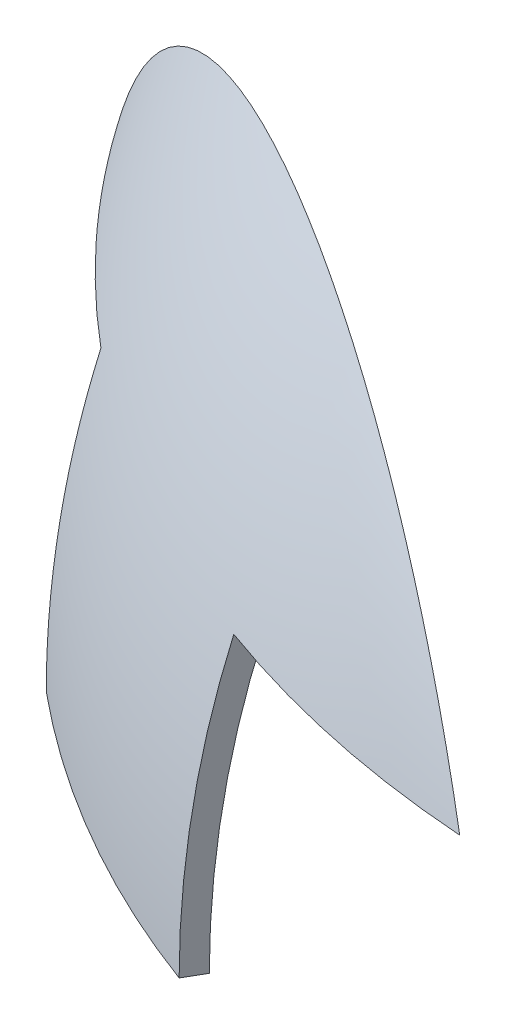
ISO-10303-21;
HEADER;
FILE_DESCRIPTION(('STEP AP214'),'2;1');
FILE_NAME('part.step','',(''),(''),'','','');
FILE_SCHEMA(('AUTOMOTIVE_DESIGN { 1 0 10303 214 1 1 1 1 }'));
ENDSEC;
DATA;
#1=APPLICATION_CONTEXT('core data for automotive mechanical design processes');
#2=APPLICATION_PROTOCOL_DEFINITION('international standard','automotive_design',2000,#1);
#3=PRODUCT_CONTEXT('',#1,'mechanical');
#4=PRODUCT('Part','Part','',(#3));
#5=PRODUCT_RELATED_PRODUCT_CATEGORY('part','',(#4));
#6=PRODUCT_DEFINITION_FORMATION('','',#4);
#7=PRODUCT_DEFINITION_CONTEXT('part definition',#1,'design');
#8=PRODUCT_DEFINITION('design','',#6,#7);
#9=PRODUCT_DEFINITION_SHAPE('','',#8);
#10=(LENGTH_UNIT() NAMED_UNIT(*) SI_UNIT(.MILLI.,.METRE.));
#11=(NAMED_UNIT(*) PLANE_ANGLE_UNIT() SI_UNIT($,.RADIAN.));
#12=(NAMED_UNIT(*) SI_UNIT($,.STERADIAN.) SOLID_ANGLE_UNIT());
#13=UNCERTAINTY_MEASURE_WITH_UNIT(LENGTH_MEASURE(1.E-05),#10,'distance_accuracy_value','');
#14=(GEOMETRIC_REPRESENTATION_CONTEXT(3) GLOBAL_UNCERTAINTY_ASSIGNED_CONTEXT((#13)) GLOBAL_UNIT_ASSIGNED_CONTEXT((#10,
#11,#12)) REPRESENTATION_CONTEXT('',''));
#15=CARTESIAN_POINT('',(0.,0.,0.));
#16=DIRECTION('',(0.,0.,1.));
#17=DIRECTION('',(1.,0.,0.));
#18=AXIS2_PLACEMENT_3D('',#15,#16,#17);
#19=CARTESIAN_POINT('',(0.,0.,0.));
#20=DIRECTION('',(1.,0.,0.));
#21=DIRECTION('',(0.,0.,1.));
#22=AXIS2_PLACEMENT_3D('',#19,#20,#21);
#23=SPHERICAL_SURFACE('',#22,147.);
#24=CARTESIAN_POINT('',(-21.6506350946111,0.,-12.5000000000001));
#25=DIRECTION('',(0.866025403784438,0.,0.500000000000001));
#26=DIRECTION('',(0.500000000000001,0.,-0.866025403784438));
#27=AXIS2_PLACEMENT_3D('',#24,#25,#26);
#28=CIRCLE('',#27,144.858551697855);
#29=CARTESIAN_POINT('',(-91.2638522304396,40.,108.073628957579));
#30=VERTEX_POINT('',#29);
#31=CARTESIAN_POINT('',(-94.0799109435385,0.,112.951185725763));
#32=VERTEX_POINT('',#31);
#33=EDGE_CURVE('E93',#30,#32,#28,.T.);
#34=ORIENTED_EDGE('',*,*,#33,.F.);
#35=CARTESIAN_POINT('',(0.,40.,0.));
#36=DIRECTION('',(0.,1.,0.));
#37=DIRECTION('',(0.,0.,1.));
#38=AXIS2_PLACEMENT_3D('',#35,#36,#37);
#39=CIRCLE('',#38,141.45317246354);
#40=CARTESIAN_POINT('',(-113.433860689943,40.,84.5089299954429));
#41=VERTEX_POINT('',#40);
#42=EDGE_CURVE('E85',#41,#30,#39,.T.);
#43=ORIENTED_EDGE('',*,*,#42,.F.);
#44=CARTESIAN_POINT('',(-64.951905283833,0.,112.5));
#45=DIRECTION('',(0.500000000000001,0.,-0.866025403784438));
#46=DIRECTION('',(-0.866025403784438,0.,-0.500000000000001));
#47=AXIS2_PLACEMENT_3D('',#44,#45,#46);
#48=CIRCLE('',#47,68.8040696470784);
#49=CARTESIAN_POINT('',(-16.4699498777232,40.,140.491070004557));
#50=VERTEX_POINT('',#49);
#51=EDGE_CURVE('E55',#41,#50,#48,.T.);
#52=ORIENTED_EDGE('',*,*,#51,.T.);
#53=CARTESIAN_POINT('',(0.,40.,0.));
#54=DIRECTION('',(0.,1.,0.));
#55=DIRECTION('',(0.,0.,1.));
#56=AXIS2_PLACEMENT_3D('',#53,#54,#55);
#57=CIRCLE('',#56,141.45317246354);
#58=CARTESIAN_POINT('',(-47.9625820412175,40.,133.073628957579));
#59=VERTEX_POINT('',#58);
#60=EDGE_CURVE('E104',#59,#50,#57,.T.);
#61=ORIENTED_EDGE('',*,*,#60,.F.);
#62=CARTESIAN_POINT('',(21.6506350946111,0.,12.5000000000001));
#63=DIRECTION('',(-0.866025403784438,0.,-0.500000000000001));
#64=DIRECTION('',(-0.500000000000001,0.,0.866025403784438));
#65=AXIS2_PLACEMENT_3D('',#62,#63,#64);
#66=CIRCLE('',#65,144.858551697855);
#67=CARTESIAN_POINT('',(-50.7786407543163,0.,137.951185725763));
#68=VERTEX_POINT('',#67);
#69=EDGE_CURVE('E99',#68,#59,#66,.T.);
#70=ORIENTED_EDGE('',*,*,#69,.F.);
#71=CARTESIAN_POINT('',(0.,0.,0.));
#72=DIRECTION('',(0.,1.,0.));
#73=DIRECTION('',(0.,0.,1.));
#74=AXIS2_PLACEMENT_3D('',#71,#72,#73);
#75=CIRCLE('',#74,147.);
#76=EDGE_CURVE('E102',#32,#68,#75,.T.);
#77=ORIENTED_EDGE('',*,*,#76,.F.);
#78=EDGE_LOOP('',(#34,#43,#52,#61,#70,#77));
#79=FACE_BOUND('',#78,.T.);
#80=ADVANCED_FACE('F33',(#79),#23,.F.);
#81=CARTESIAN_POINT('',(-150.,0.,-150.));
#82=DIRECTION('',(0.,1.,0.));
#83=DIRECTION('',(0.,0.,1.));
#84=AXIS2_PLACEMENT_3D('',#81,#82,#83);
#85=PLANE('',#84);
#86=CARTESIAN_POINT('',(0.,0.,0.));
#87=DIRECTION('',(0.,1.,0.));
#88=DIRECTION('',(0.,0.,1.));
#89=AXIS2_PLACEMENT_3D('',#86,#87,#88);
#90=CIRCLE('',#89,150.);
#91=CARTESIAN_POINT('',(-52.3003621941342,0.,140.586884574495));
#92=VERTEX_POINT('',#91);
#93=CARTESIAN_POINT('',(-95.6016323833564,0.,115.586884574495));
#94=VERTEX_POINT('',#93);
#95=EDGE_CURVE('E98',#92,#94,#90,.F.);
#96=ORIENTED_EDGE('',*,*,#95,.T.);
#97=DIRECTION('',(0.500000000000001,0.,-0.866025403784438));
#98=VECTOR('',#97,1.);
#99=CARTESIAN_POINT('',(-119.078493020361,0.,156.25));
#100=LINE('',#99,#98);
#101=EDGE_CURVE('E134',#94,#32,#100,.T.);
#102=ORIENTED_EDGE('',*,*,#101,.T.);
#103=ORIENTED_EDGE('',*,*,#76,.T.);
#104=DIRECTION('',(0.500000000000001,0.,-0.866025403784438));
#105=VECTOR('',#104,1.);
#106=CARTESIAN_POINT('',(-75.7772228311385,0.,181.25));
#107=LINE('',#106,#105);
#108=EDGE_CURVE('E118',#92,#68,#107,.T.);
#109=ORIENTED_EDGE('',*,*,#108,.F.);
#110=EDGE_LOOP('',(#96,#102,#103,#109));
#111=FACE_BOUND('',#110,.T.);
#112=ADVANCED_FACE('F126',(#111),#85,.F.);
#113=CARTESIAN_POINT('',(0.,0.,0.));
#114=DIRECTION('',(1.,0.,0.));
#115=DIRECTION('',(0.,0.,-1.));
#116=AXIS2_PLACEMENT_3D('',#113,#114,#115);
#117=SPHERICAL_SURFACE('',#116,150.);
#118=CARTESIAN_POINT('',(-21.6506350946111,0.,-12.5000000000001));
#119=DIRECTION('',(0.866025403784438,0.,0.500000000000001));
#120=DIRECTION('',(0.500000000000001,0.,-0.866025403784438));
#121=AXIS2_PLACEMENT_3D('',#118,#119,#120);
#122=CIRCLE('',#121,147.90199457749);
#123=CARTESIAN_POINT('',(-92.8457894241019,40.,110.813624551385));
#124=VERTEX_POINT('',#123);
#125=EDGE_CURVE('E11',#94,#124,#122,.F.);
#126=ORIENTED_EDGE('',*,*,#125,.F.);
#127=ORIENTED_EDGE('',*,*,#95,.F.);
#128=CARTESIAN_POINT('',(21.6506350946111,0.,12.5000000000001));
#129=DIRECTION('',(-0.866025403784438,0.,-0.500000000000001));
#130=DIRECTION('',(-0.500000000000001,0.,0.866025403784438));
#131=AXIS2_PLACEMENT_3D('',#128,#129,#130);
#132=CIRCLE('',#131,147.90199457749);
#133=CARTESIAN_POINT('',(-49.5445192348798,40.,135.813624551385));
#134=VERTEX_POINT('',#133);
#135=EDGE_CURVE('E90',#134,#92,#132,.F.);
#136=ORIENTED_EDGE('',*,*,#135,.F.);
#137=CARTESIAN_POINT('',(0.,40.,0.));
#138=DIRECTION('',(0.,1.,0.));
#139=DIRECTION('',(0.,0.,1.));
#140=AXIS2_PLACEMENT_3D('',#137,#138,#139);
#141=CIRCLE('',#140,144.56832294801);
#142=CARTESIAN_POINT('',(-10.0087528442431,40.,144.221443851124));
#143=VERTEX_POINT('',#142);
#144=EDGE_CURVE('E140',#143,#134,#141,.F.);
#145=ORIENTED_EDGE('',*,*,#144,.F.);
#146=CARTESIAN_POINT('',(-64.951905283833,0.,112.5));
#147=DIRECTION('',(0.500000000000001,0.,-0.866025403784438));
#148=DIRECTION('',(-0.866025403784438,0.,-0.500000000000001));
#149=AXIS2_PLACEMENT_3D('',#146,#147,#148);
#150=CIRCLE('',#149,75.0000000000002);
#151=CARTESIAN_POINT('',(-119.895057723423,40.,80.7785561488759));
#152=VERTEX_POINT('',#151);
#153=EDGE_CURVE('E109',#143,#152,#150,.F.);
#154=ORIENTED_EDGE('',*,*,#153,.T.);
#155=CARTESIAN_POINT('',(0.,40.,0.));
#156=DIRECTION('',(0.,1.,0.));
#157=DIRECTION('',(0.,0.,1.));
#158=AXIS2_PLACEMENT_3D('',#155,#156,#157);
#159=CIRCLE('',#158,144.56832294801);
#160=EDGE_CURVE('E47',#124,#152,#159,.F.);
#161=ORIENTED_EDGE('',*,*,#160,.F.);
#162=EDGE_LOOP('',(#126,#127,#136,#145,#154,#161));
#163=FACE_BOUND('',#162,.T.);
#164=ADVANCED_FACE('F130',(#163),#117,.T.);
#165=CARTESIAN_POINT('',(-129.903810567666,150.,74.9999999999997));
#166=DIRECTION('',(0.500000000000001,0.,-0.866025403784438));
#167=DIRECTION('',(-0.866025403784438,0.,-0.500000000000001));
#168=AXIS2_PLACEMENT_3D('',#165,#166,#167);
#169=PLANE('',#168);
#170=DIRECTION('',(0.866025403784438,0.,0.500000000000001));
#171=VECTOR('',#170,1.);
#172=CARTESIAN_POINT('',(-129.903810567666,40.,74.9999999999997));
#173=LINE('',#172,#171);
#174=EDGE_CURVE('E40',#152,#41,#173,.T.);
#175=ORIENTED_EDGE('',*,*,#174,.F.);
#176=ORIENTED_EDGE('',*,*,#153,.F.);
#177=DIRECTION('',(0.866025403784438,0.,0.500000000000001));
#178=VECTOR('',#177,1.);
#179=CARTESIAN_POINT('',(-129.903810567666,40.,74.9999999999997));
#180=LINE('',#179,#178);
#181=EDGE_CURVE('E97',#50,#143,#180,.T.);
#182=ORIENTED_EDGE('',*,*,#181,.F.);
#183=ORIENTED_EDGE('',*,*,#51,.F.);
#184=EDGE_LOOP('',(#175,#176,#182,#183));
#185=FACE_BOUND('',#184,.T.);
#186=ADVANCED_FACE('F96',(#185),#169,.T.);
#187=CARTESIAN_POINT('',(-32.4759526419166,40.,206.25));
#188=DIRECTION('',(0.,1.,0.));
#189=DIRECTION('',(0.,0.,1.));
#190=AXIS2_PLACEMENT_3D('',#187,#188,#189);
#191=PLANE('',#190);
#192=ORIENTED_EDGE('',*,*,#60,.T.);
#193=ORIENTED_EDGE('',*,*,#181,.T.);
#194=ORIENTED_EDGE('',*,*,#144,.T.);
#195=DIRECTION('',(0.500000000000001,0.,-0.866025403784438));
#196=VECTOR('',#195,1.);
#197=CARTESIAN_POINT('',(-75.7772228311385,40.,181.25));
#198=LINE('',#197,#196);
#199=EDGE_CURVE('E121',#134,#59,#198,.T.);
#200=ORIENTED_EDGE('',*,*,#199,.T.);
#201=EDGE_LOOP('',(#192,#193,#194,#200));
#202=FACE_BOUND('',#201,.T.);
#203=ADVANCED_FACE('F143',(#202),#191,.F.);
#204=CARTESIAN_POINT('',(-75.7772228311385,40.,181.25));
#205=DIRECTION('',(-0.866025403784438,0.,-0.500000000000001));
#206=DIRECTION('',(-0.500000000000001,0.,0.866025403784438));
#207=AXIS2_PLACEMENT_3D('',#204,#205,#206);
#208=PLANE('',#207);
#209=ORIENTED_EDGE('',*,*,#69,.T.);
#210=ORIENTED_EDGE('',*,*,#199,.F.);
#211=ORIENTED_EDGE('',*,*,#135,.T.);
#212=ORIENTED_EDGE('',*,*,#108,.T.);
#213=EDGE_LOOP('',(#209,#210,#211,#212));
#214=FACE_BOUND('',#213,.T.);
#215=ADVANCED_FACE('F117',(#214),#208,.F.);
#216=CARTESIAN_POINT('',(-119.078493020361,40.,156.25));
#217=DIRECTION('',(0.866025403784438,0.,0.500000000000001));
#218=DIRECTION('',(0.500000000000001,0.,-0.866025403784438));
#219=AXIS2_PLACEMENT_3D('',#216,#217,#218);
#220=PLANE('',#219);
#221=ORIENTED_EDGE('',*,*,#33,.T.);
#222=ORIENTED_EDGE('',*,*,#101,.F.);
#223=ORIENTED_EDGE('',*,*,#125,.T.);
#224=DIRECTION('',(0.500000000000001,0.,-0.866025403784438));
#225=VECTOR('',#224,1.);
#226=CARTESIAN_POINT('',(-119.078493020361,40.,156.25));
#227=LINE('',#226,#225);
#228=EDGE_CURVE('E133',#124,#30,#227,.T.);
#229=ORIENTED_EDGE('',*,*,#228,.T.);
#230=EDGE_LOOP('',(#221,#222,#223,#229));
#231=FACE_BOUND('',#230,.T.);
#232=ADVANCED_FACE('F132',(#231),#220,.F.);
#233=CARTESIAN_POINT('',(-119.078493020361,40.,156.25));
#234=DIRECTION('',(0.,1.,0.));
#235=DIRECTION('',(0.,0.,1.));
#236=AXIS2_PLACEMENT_3D('',#233,#234,#235);
#237=PLANE('',#236);
#238=ORIENTED_EDGE('',*,*,#42,.T.);
#239=ORIENTED_EDGE('',*,*,#228,.F.);
#240=ORIENTED_EDGE('',*,*,#160,.T.);
#241=ORIENTED_EDGE('',*,*,#174,.T.);
#242=EDGE_LOOP('',(#238,#239,#240,#241));
#243=FACE_BOUND('',#242,.T.);
#244=ADVANCED_FACE('F84',(#243),#237,.F.);
#245=CLOSED_SHELL('',(#80,#112,#164,#186,#203,#215,#232,#244));
#246=MANIFOLD_SOLID_BREP('B2',#245);
#247=ADVANCED_BREP_SHAPE_REPRESENTATION('',(#18,#246),#14);
#248=SHAPE_DEFINITION_REPRESENTATION(#9,#247);
ENDSEC;
END-ISO-10303-21;
